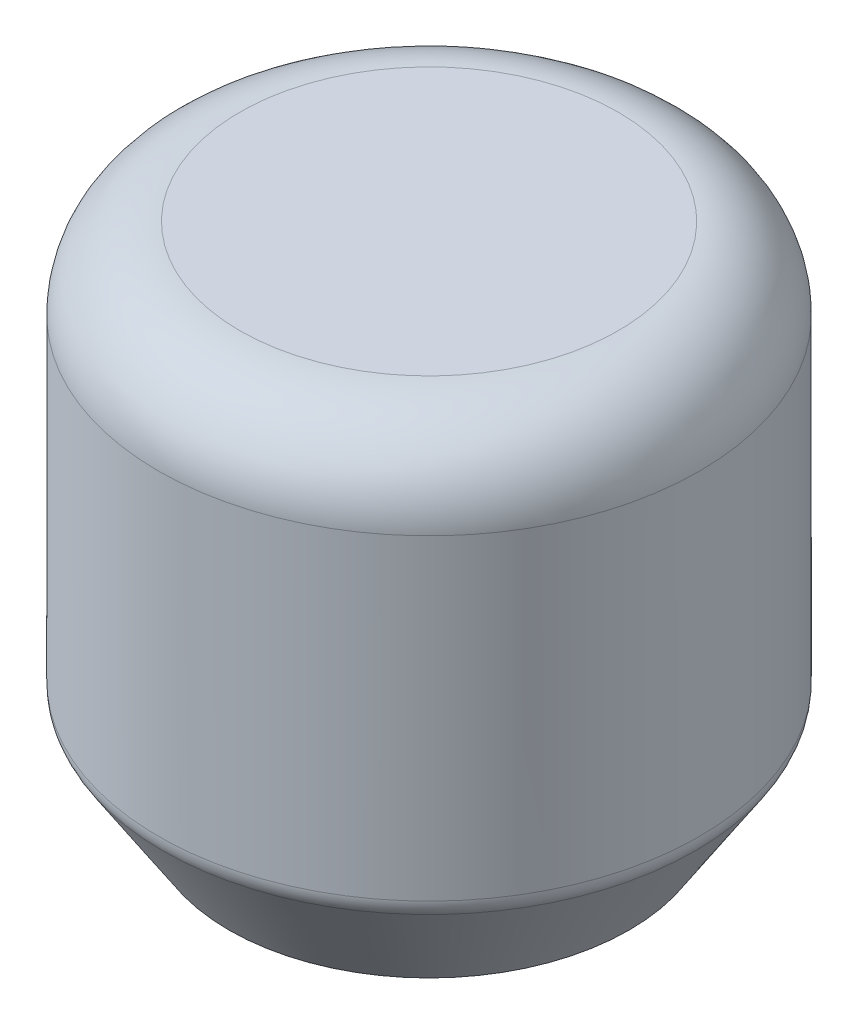
ISO-10303-21;
HEADER;
FILE_DESCRIPTION(('STEP AP214'),'2;1');
FILE_NAME('part.step','',(''),(''),'','','');
FILE_SCHEMA(('AUTOMOTIVE_DESIGN { 1 0 10303 214 1 1 1 1 }'));
ENDSEC;
DATA;
#1=APPLICATION_CONTEXT('core data for automotive mechanical design processes');
#2=APPLICATION_PROTOCOL_DEFINITION('international standard','automotive_design',2000,#1);
#3=PRODUCT_CONTEXT('',#1,'mechanical');
#4=PRODUCT('Part','Part','',(#3));
#5=PRODUCT_RELATED_PRODUCT_CATEGORY('part','',(#4));
#6=PRODUCT_DEFINITION_FORMATION('','',#4);
#7=PRODUCT_DEFINITION_CONTEXT('part definition',#1,'design');
#8=PRODUCT_DEFINITION('design','',#6,#7);
#9=PRODUCT_DEFINITION_SHAPE('','',#8);
#10=(LENGTH_UNIT() NAMED_UNIT(*) SI_UNIT(.MILLI.,.METRE.));
#11=(NAMED_UNIT(*) PLANE_ANGLE_UNIT() SI_UNIT($,.RADIAN.));
#12=(NAMED_UNIT(*) SI_UNIT($,.STERADIAN.) SOLID_ANGLE_UNIT());
#13=UNCERTAINTY_MEASURE_WITH_UNIT(LENGTH_MEASURE(1.E-05),#10,'distance_accuracy_value','');
#14=(GEOMETRIC_REPRESENTATION_CONTEXT(3) GLOBAL_UNCERTAINTY_ASSIGNED_CONTEXT((#13)) GLOBAL_UNIT_ASSIGNED_CONTEXT((#10,
#11,#12)) REPRESENTATION_CONTEXT('',''));
#15=CARTESIAN_POINT('',(0.,0.,0.));
#16=DIRECTION('',(0.,0.,1.));
#17=DIRECTION('',(1.,0.,0.));
#18=AXIS2_PLACEMENT_3D('',#15,#16,#17);
#19=CARTESIAN_POINT('',(0.,241.3,0.));
#20=DIRECTION('',(0.,-1.,0.));
#21=DIRECTION('',(0.,0.,-1.));
#22=AXIS2_PLACEMENT_3D('',#19,#20,#21);
#23=CYLINDRICAL_SURFACE('',#22,127.);
#24=CARTESIAN_POINT('',(0.,54.6082524911767,0.));
#25=DIRECTION('',(0.,-1.,0.));
#26=DIRECTION('',(0.,0.,-1.));
#27=AXIS2_PLACEMENT_3D('',#24,#25,#26);
#28=CIRCLE('',#27,127.);
#29=CARTESIAN_POINT('',(0.,54.6082524911767,-127.));
#30=VERTEX_POINT('',#29);
#31=EDGE_CURVE('E46',#30,#30,#28,.F.);
#32=CARTESIAN_POINT('',(0.,203.2,0.));
#33=DIRECTION('',(0.,1.,0.));
#34=DIRECTION('',(0.,0.,1.));
#35=AXIS2_PLACEMENT_3D('',#32,#33,#34);
#36=CIRCLE('',#35,127.);
#37=CARTESIAN_POINT('',(0.,203.2,-127.));
#38=VERTEX_POINT('',#37);
#39=EDGE_CURVE('E54',#38,#38,#36,.F.);
#40=CARTESIAN_POINT('',(0.,54.6082524911767,-127.));
#41=CARTESIAN_POINT('',(0.,56.1560831943936,-127.));
#42=CARTESIAN_POINT('',(0.,57.7039138976106,-127.));
#43=CARTESIAN_POINT('',(0.,60.7995753040444,-127.));
#44=CARTESIAN_POINT('',(0.,62.3474060072613,-127.));
#45=CARTESIAN_POINT('',(0.,65.4430674136951,-127.));
#46=CARTESIAN_POINT('',(0.,66.990898116912,-127.));
#47=CARTESIAN_POINT('',(0.,70.0865595233458,-127.));
#48=CARTESIAN_POINT('',(0.,71.6343902265627,-127.));
#49=CARTESIAN_POINT('',(0.,74.7300516329965,-127.));
#50=CARTESIAN_POINT('',(0.,76.2778823362135,-127.));
#51=CARTESIAN_POINT('',(0.,79.3735437426473,-127.));
#52=CARTESIAN_POINT('',(0.,80.9213744458642,-127.));
#53=CARTESIAN_POINT('',(0.,84.017035852298,-127.));
#54=CARTESIAN_POINT('',(0.,85.5648665555149,-127.));
#55=CARTESIAN_POINT('',(0.,88.6605279619487,-127.));
#56=CARTESIAN_POINT('',(0.,90.2083586651656,-127.));
#57=CARTESIAN_POINT('',(0.,93.3040200715995,-127.));
#58=CARTESIAN_POINT('',(0.,94.8518507748164,-127.));
#59=CARTESIAN_POINT('',(0.,97.9475121812502,-127.));
#60=CARTESIAN_POINT('',(0.,99.4953428844671,-127.));
#61=CARTESIAN_POINT('',(0.,102.591004290901,-127.));
#62=CARTESIAN_POINT('',(0.,104.138834994118,-127.));
#63=CARTESIAN_POINT('',(0.,107.234496400552,-127.));
#64=CARTESIAN_POINT('',(0.,108.782327103769,-127.));
#65=CARTESIAN_POINT('',(0.,111.877988510202,-127.));
#66=CARTESIAN_POINT('',(0.,113.425819213419,-127.));
#67=CARTESIAN_POINT('',(0.,116.521480619853,-127.));
#68=CARTESIAN_POINT('',(0.,118.06931132307,-127.));
#69=CARTESIAN_POINT('',(0.,121.164972729504,-127.));
#70=CARTESIAN_POINT('',(0.,122.712803432721,-127.));
#71=CARTESIAN_POINT('',(0.,125.808464839155,-127.));
#72=CARTESIAN_POINT('',(0.,127.356295542371,-127.));
#73=CARTESIAN_POINT('',(0.,130.451956948805,-127.));
#74=CARTESIAN_POINT('',(0.,131.999787652022,-127.));
#75=CARTESIAN_POINT('',(0.,135.095449058456,-127.));
#76=CARTESIAN_POINT('',(0.,136.643279761673,-127.));
#77=CARTESIAN_POINT('',(0.,139.738941168107,-127.));
#78=CARTESIAN_POINT('',(0.,141.286771871324,-127.));
#79=CARTESIAN_POINT('',(0.,144.382433277757,-127.));
#80=CARTESIAN_POINT('',(0.,145.930263980974,-127.));
#81=CARTESIAN_POINT('',(0.,149.025925387408,-127.));
#82=CARTESIAN_POINT('',(0.,150.573756090625,-127.));
#83=CARTESIAN_POINT('',(0.,153.669417497059,-127.));
#84=CARTESIAN_POINT('',(0.,155.217248200276,-127.));
#85=CARTESIAN_POINT('',(0.,158.31290960671,-127.));
#86=CARTESIAN_POINT('',(0.,159.860740309927,-127.));
#87=CARTESIAN_POINT('',(0.,162.95640171636,-127.));
#88=CARTESIAN_POINT('',(0.,164.504232419577,-127.));
#89=CARTESIAN_POINT('',(0.,167.599893826011,-127.));
#90=CARTESIAN_POINT('',(0.,169.147724529228,-127.));
#91=CARTESIAN_POINT('',(0.,172.243385935662,-127.));
#92=CARTESIAN_POINT('',(0.,173.791216638879,-127.));
#93=CARTESIAN_POINT('',(0.,176.886878045312,-127.));
#94=CARTESIAN_POINT('',(0.,178.434708748529,-127.));
#95=CARTESIAN_POINT('',(0.,181.530370154963,-127.));
#96=CARTESIAN_POINT('',(0.,183.07820085818,-127.));
#97=CARTESIAN_POINT('',(0.,186.173862264614,-127.));
#98=CARTESIAN_POINT('',(0.,187.721692967831,-127.));
#99=CARTESIAN_POINT('',(0.,190.817354374265,-127.));
#100=CARTESIAN_POINT('',(0.,192.365185077482,-127.));
#101=CARTESIAN_POINT('',(0.,195.460846483915,-127.));
#102=CARTESIAN_POINT('',(0.,197.008677187132,-127.));
#103=CARTESIAN_POINT('',(0.,200.104338593566,-127.));
#104=CARTESIAN_POINT('',(0.,201.652169296783,-127.));
#105=CARTESIAN_POINT('',(0.,203.2,-127.));
#106=B_SPLINE_CURVE_WITH_KNOTS('',3,(#40,#41,#42,#43,#44,#45,#46,#47,#48,#49,#50,#51,#52,#53,
#54,#55,#56,#57,#58,#59,#60,#61,#62,#63,#64,#65,#66,#67,#68,#69,#70,#71,#72,#73,#74,#75,#76,#77,
#78,#79,#80,#81,#82,#83,#84,#85,#86,#87,#88,#89,#90,#91,#92,#93,#94,#95,#96,#97,#98,#99,#100,
#101,#102,#103,#104,#105),.UNSPECIFIED.,.F.,.F.,(4,2,2,2,2,2,2,2,2,2,2,2,2,2,2,2,2,2,2,2,2,2,2,
2,2,2,2,2,2,2,2,2,4),(0.,4.64349210965073,9.28698421930146,13.9304763289522,18.5739684386029,
23.2174605482536,27.8609526579044,32.5044447675551,37.1479368772058,41.7914289868565,
46.4349210965073,51.078413206158,55.7219053158087,60.3653974254594,65.0088895351102,
69.6523816447609,74.2958737544116,78.9393658640624,83.5828579737131,88.2263500833638,
92.8698421930145,97.5133343026652,102.156826412316,106.800318521967,111.443810631617,
116.087302741268,120.730794850919,125.37428696057,130.01777907022,134.661271179871,
139.304763289522,143.948255399172,148.591747508823),.UNSPECIFIED.);
#107=EDGE_CURVE('BSEAM39',#30,#38,#106,.T.);
#108=ORIENTED_EDGE('',*,*,#31,.T.);
#109=ORIENTED_EDGE('',*,*,#39,.T.);
#110=ORIENTED_EDGE('',*,*,#107,.T.);
#111=ORIENTED_EDGE('',*,*,#107,.F.);
#112=EDGE_LOOP('',(#108,#110,#109,#111));
#113=FACE_BOUND('',#112,.T.);
#114=ADVANCED_FACE('F39',(#113),#23,.T.);
#115=CARTESIAN_POINT('',(0.,241.3,0.));
#116=DIRECTION('',(0.,1.,0.));
#117=DIRECTION('',(0.,0.,1.));
#118=AXIS2_PLACEMENT_3D('',#115,#116,#117);
#119=PLANE('',#118);
#120=CARTESIAN_POINT('',(0.,241.3,0.));
#121=DIRECTION('',(0.,1.,0.));
#122=DIRECTION('',(0.,0.,1.));
#123=AXIS2_PLACEMENT_3D('',#120,#121,#122);
#124=CIRCLE('',#123,88.9);
#125=CARTESIAN_POINT('',(0.,241.3,88.9));
#126=VERTEX_POINT('',#125);
#127=EDGE_CURVE('E59',#126,#126,#124,.T.);
#128=ORIENTED_EDGE('',*,*,#127,.T.);
#129=EDGE_LOOP('',(#128));
#130=FACE_BOUND('',#129,.T.);
#131=ADVANCED_FACE('F63',(#130),#119,.T.);
#132=CARTESIAN_POINT('',(0.,0.,0.));
#133=DIRECTION('',(0.,1.,0.));
#134=DIRECTION('',(0.,0.,1.));
#135=AXIS2_PLACEMENT_3D('',#132,#133,#134);
#136=PLANE('',#135);
#137=CARTESIAN_POINT('',(0.,0.,0.));
#138=DIRECTION('',(0.,1.,0.));
#139=DIRECTION('',(0.,0.,1.));
#140=AXIS2_PLACEMENT_3D('',#137,#138,#139);
#141=CIRCLE('',#140,93.9799999999994);
#142=CARTESIAN_POINT('',(0.,0.,93.9799999999994));
#143=VERTEX_POINT('',#142);
#144=EDGE_CURVE('E50',#143,#143,#141,.F.);
#145=ORIENTED_EDGE('',*,*,#144,.T.);
#146=EDGE_LOOP('',(#145));
#147=FACE_BOUND('',#146,.T.);
#148=ADVANCED_FACE('F68',(#147),#136,.F.);
#149=CARTESIAN_POINT('',(0.,203.2,0.));
#150=DIRECTION('',(0.,1.,0.));
#151=DIRECTION('',(0.,0.,1.));
#152=AXIS2_PLACEMENT_3D('',#149,#150,#151);
#153=TOROIDAL_SURFACE('',#152,88.9,38.1);
#154=ORIENTED_EDGE('',*,*,#39,.F.);
#155=EDGE_LOOP('',(#154));
#156=FACE_BOUND('',#155,.T.);
#157=ORIENTED_EDGE('',*,*,#127,.F.);
#158=EDGE_LOOP('',(#157));
#159=FACE_BOUND('',#158,.T.);
#160=ADVANCED_FACE('F65',(#156,#159),#153,.T.);
#161=CARTESIAN_POINT('',(0.,50.8463411051583,0.));
#162=DIRECTION('',(0.,1.,0.));
#163=DIRECTION('',(0.,0.,1.));
#164=AXIS2_PLACEMENT_3D('',#161,#162,#163);
#165=CONICAL_SURFACE('',#164,127.,0.57595865315813);
#166=CARTESIAN_POINT('',(0.,47.6913367464859,0.));
#167=DIRECTION('',(0.,1.,0.));
#168=DIRECTION('',(0.,0.,1.));
#169=AXIS2_PLACEMENT_3D('',#166,#167,#168);
#170=CIRCLE('',#169,124.951116212907);
#171=CARTESIAN_POINT('',(0.,47.6913367464859,124.951116212907));
#172=VERTEX_POINT('',#171);
#173=EDGE_CURVE('E10',#172,#172,#170,.F.);
#174=ORIENTED_EDGE('',*,*,#173,.T.);
#175=EDGE_LOOP('',(#174));
#176=FACE_BOUND('',#175,.T.);
#177=ORIENTED_EDGE('',*,*,#144,.F.);
#178=EDGE_LOOP('',(#177));
#179=FACE_BOUND('',#178,.T.);
#180=ADVANCED_FACE('F67',(#176,#179),#165,.T.);
#181=CARTESIAN_POINT('',(0.,54.6082524911767,0.));
#182=DIRECTION('',(0.,-1.,0.));
#183=DIRECTION('',(0.,0.,-1.));
#184=AXIS2_PLACEMENT_3D('',#181,#182,#183);
#185=TOROIDAL_SURFACE('',#184,114.3,12.7);
#186=ORIENTED_EDGE('',*,*,#173,.F.);
#187=EDGE_LOOP('',(#186));
#188=FACE_BOUND('',#187,.T.);
#189=ORIENTED_EDGE('',*,*,#31,.F.);
#190=EDGE_LOOP('',(#189));
#191=FACE_BOUND('',#190,.T.);
#192=ADVANCED_FACE('F41',(#188,#191),#185,.T.);
#193=CLOSED_SHELL('',(#114,#131,#148,#160,#180,#192));
#194=MANIFOLD_SOLID_BREP('B2',#193);
#195=ADVANCED_BREP_SHAPE_REPRESENTATION('',(#18,#194),#14);
#196=SHAPE_DEFINITION_REPRESENTATION(#9,#195);
ENDSEC;
END-ISO-10303-21;
